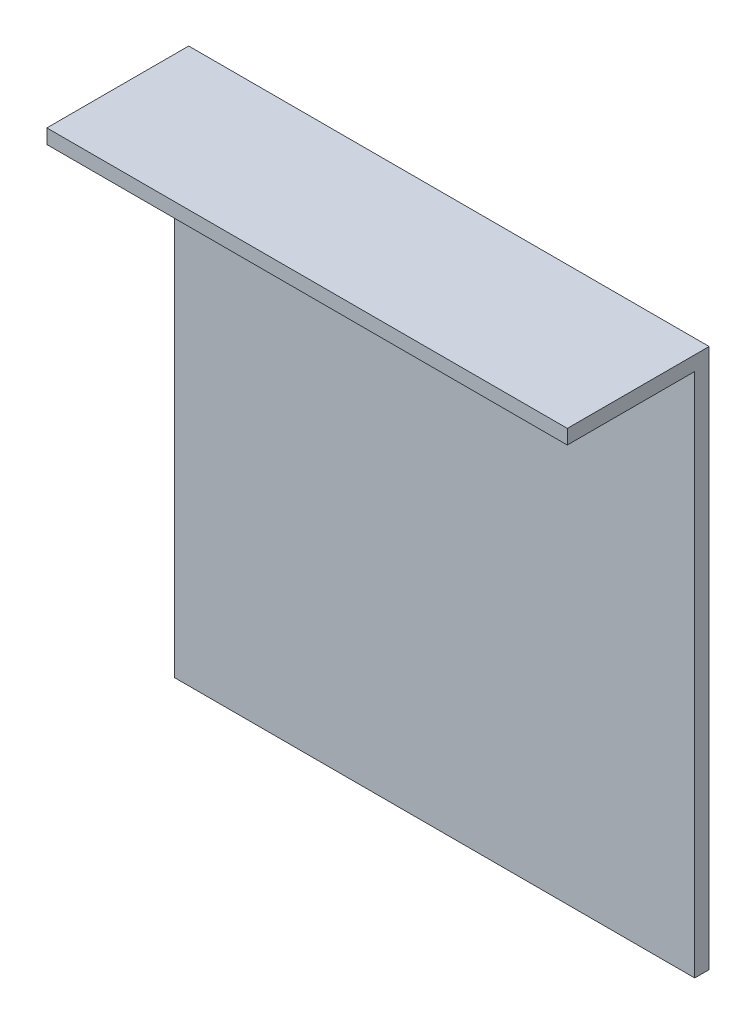
ISO-10303-21;
HEADER;
FILE_DESCRIPTION(('STEP AP214'),'2;1');
FILE_NAME('part.step','',(''),(''),'','','');
FILE_SCHEMA(('AUTOMOTIVE_DESIGN { 1 0 10303 214 1 1 1 1 }'));
ENDSEC;
DATA;
#1=APPLICATION_CONTEXT('core data for automotive mechanical design processes');
#2=APPLICATION_PROTOCOL_DEFINITION('international standard','automotive_design',2000,#1);
#3=PRODUCT_CONTEXT('',#1,'mechanical');
#4=PRODUCT('Part','Part','',(#3));
#5=PRODUCT_RELATED_PRODUCT_CATEGORY('part','',(#4));
#6=PRODUCT_DEFINITION_FORMATION('','',#4);
#7=PRODUCT_DEFINITION_CONTEXT('part definition',#1,'design');
#8=PRODUCT_DEFINITION('design','',#6,#7);
#9=PRODUCT_DEFINITION_SHAPE('','',#8);
#10=(LENGTH_UNIT() NAMED_UNIT(*) SI_UNIT(.MILLI.,.METRE.));
#11=(NAMED_UNIT(*) PLANE_ANGLE_UNIT() SI_UNIT($,.RADIAN.));
#12=(NAMED_UNIT(*) SI_UNIT($,.STERADIAN.) SOLID_ANGLE_UNIT());
#13=UNCERTAINTY_MEASURE_WITH_UNIT(LENGTH_MEASURE(1.E-05),#10,'distance_accuracy_value','');
#14=(GEOMETRIC_REPRESENTATION_CONTEXT(3) GLOBAL_UNCERTAINTY_ASSIGNED_CONTEXT((#13)) GLOBAL_UNIT_ASSIGNED_CONTEXT((#10,
#11,#12)) REPRESENTATION_CONTEXT('',''));
#15=CARTESIAN_POINT('',(0.,0.,0.));
#16=DIRECTION('',(0.,0.,1.));
#17=DIRECTION('',(1.,0.,0.));
#18=AXIS2_PLACEMENT_3D('',#15,#16,#17);
#19=CARTESIAN_POINT('',(-216.5,-230.,12.));
#20=DIRECTION('',(0.,1.,0.));
#21=DIRECTION('',(0.,0.,1.));
#22=AXIS2_PLACEMENT_3D('',#19,#20,#21);
#23=PLANE('',#22);
#24=DIRECTION('',(1.,0.,0.));
#25=VECTOR('',#24,1.);
#26=CARTESIAN_POINT('',(-216.5,-230.,0.));
#27=LINE('',#26,#25);
#28=CARTESIAN_POINT('',(-216.5,-230.,0.));
#29=VERTEX_POINT('',#28);
#30=CARTESIAN_POINT('',(216.5,-230.,0.));
#31=VERTEX_POINT('',#30);
#32=EDGE_CURVE('E91',#29,#31,#27,.T.);
#33=ORIENTED_EDGE('',*,*,#32,.T.);
#34=DIRECTION('',(0.,0.,-1.));
#35=VECTOR('',#34,1.);
#36=CARTESIAN_POINT('',(216.5,-230.,12.));
#37=LINE('',#36,#35);
#38=CARTESIAN_POINT('',(216.5,-230.,12.));
#39=VERTEX_POINT('',#38);
#40=EDGE_CURVE('E11',#39,#31,#37,.T.);
#41=ORIENTED_EDGE('',*,*,#40,.F.);
#42=DIRECTION('',(1.,0.,0.));
#43=VECTOR('',#42,1.);
#44=CARTESIAN_POINT('',(-216.5,-230.,12.));
#45=LINE('',#44,#43);
#46=CARTESIAN_POINT('',(-216.5,-230.,12.));
#47=VERTEX_POINT('',#46);
#48=EDGE_CURVE('E85',#47,#39,#45,.T.);
#49=ORIENTED_EDGE('',*,*,#48,.F.);
#50=DIRECTION('',(0.,0.,-1.));
#51=VECTOR('',#50,1.);
#52=CARTESIAN_POINT('',(-216.5,-230.,12.));
#53=LINE('',#52,#51);
#54=EDGE_CURVE('E77',#47,#29,#53,.T.);
#55=ORIENTED_EDGE('',*,*,#54,.T.);
#56=EDGE_LOOP('',(#33,#41,#49,#55));
#57=FACE_BOUND('',#56,.T.);
#58=ADVANCED_FACE('F33',(#57),#23,.F.);
#59=CARTESIAN_POINT('',(216.5,-230.,12.));
#60=DIRECTION('',(-1.,0.,0.));
#61=DIRECTION('',(0.,0.,1.));
#62=AXIS2_PLACEMENT_3D('',#59,#60,#61);
#63=PLANE('',#62);
#64=DIRECTION('',(0.,1.,0.));
#65=VECTOR('',#64,1.);
#66=CARTESIAN_POINT('',(216.5,-230.,0.));
#67=LINE('',#66,#65);
#68=CARTESIAN_POINT('',(216.5,219.,0.));
#69=VERTEX_POINT('',#68);
#70=EDGE_CURVE('E94',#31,#69,#67,.T.);
#71=ORIENTED_EDGE('',*,*,#70,.T.);
#72=DIRECTION('',(0.,0.,-1.));
#73=VECTOR('',#72,1.);
#74=CARTESIAN_POINT('',(216.5,219.,12.));
#75=LINE('',#74,#73);
#76=CARTESIAN_POINT('',(216.5,219.,118.));
#77=VERTEX_POINT('',#76);
#78=EDGE_CURVE('E41',#77,#69,#75,.T.);
#79=ORIENTED_EDGE('',*,*,#78,.F.);
#80=DIRECTION('',(0.,1.,0.));
#81=VECTOR('',#80,1.);
#82=CARTESIAN_POINT('',(216.5,219.,118.));
#83=LINE('',#82,#81);
#84=CARTESIAN_POINT('',(216.5,207.,118.));
#85=VERTEX_POINT('',#84);
#86=EDGE_CURVE('E128',#85,#77,#83,.T.);
#87=ORIENTED_EDGE('',*,*,#86,.F.);
#88=DIRECTION('',(0.,0.,-1.));
#89=VECTOR('',#88,1.);
#90=CARTESIAN_POINT('',(216.5,207.,118.));
#91=LINE('',#90,#89);
#92=CARTESIAN_POINT('',(216.5,207.,12.));
#93=VERTEX_POINT('',#92);
#94=EDGE_CURVE('E99',#85,#93,#91,.T.);
#95=ORIENTED_EDGE('',*,*,#94,.T.);
#96=DIRECTION('',(0.,1.,0.));
#97=VECTOR('',#96,1.);
#98=CARTESIAN_POINT('',(216.5,-230.,12.));
#99=LINE('',#98,#97);
#100=EDGE_CURVE('E108',#39,#93,#99,.T.);
#101=ORIENTED_EDGE('',*,*,#100,.F.);
#102=ORIENTED_EDGE('',*,*,#40,.T.);
#103=EDGE_LOOP('',(#71,#79,#87,#95,#101,#102));
#104=FACE_BOUND('',#103,.T.);
#105=ADVANCED_FACE('F148',(#104),#63,.F.);
#106=CARTESIAN_POINT('',(-216.5,219.,12.));
#107=DIRECTION('',(0.,-1.,0.));
#108=DIRECTION('',(0.,0.,-1.));
#109=AXIS2_PLACEMENT_3D('',#106,#107,#108);
#110=PLANE('',#109);
#111=DIRECTION('',(-1.,0.,0.));
#112=VECTOR('',#111,1.);
#113=CARTESIAN_POINT('',(-216.5,219.,0.));
#114=LINE('',#113,#112);
#115=CARTESIAN_POINT('',(-216.5,219.,0.));
#116=VERTEX_POINT('',#115);
#117=EDGE_CURVE('E86',#69,#116,#114,.T.);
#118=ORIENTED_EDGE('',*,*,#117,.T.);
#119=DIRECTION('',(0.,0.,-1.));
#120=VECTOR('',#119,1.);
#121=CARTESIAN_POINT('',(-216.5,219.,12.));
#122=LINE('',#121,#120);
#123=CARTESIAN_POINT('',(-216.5,219.,118.));
#124=VERTEX_POINT('',#123);
#125=EDGE_CURVE('E81',#124,#116,#122,.T.);
#126=ORIENTED_EDGE('',*,*,#125,.F.);
#127=DIRECTION('',(-1.,0.,0.));
#128=VECTOR('',#127,1.);
#129=CARTESIAN_POINT('',(-216.5,219.,118.));
#130=LINE('',#129,#128);
#131=EDGE_CURVE('E116',#77,#124,#130,.T.);
#132=ORIENTED_EDGE('',*,*,#131,.F.);
#133=ORIENTED_EDGE('',*,*,#78,.T.);
#134=EDGE_LOOP('',(#118,#126,#132,#133));
#135=FACE_BOUND('',#134,.T.);
#136=ADVANCED_FACE('F151',(#135),#110,.F.);
#137=CARTESIAN_POINT('',(-216.5,-230.,12.));
#138=DIRECTION('',(1.,0.,0.));
#139=DIRECTION('',(0.,0.,-1.));
#140=AXIS2_PLACEMENT_3D('',#137,#138,#139);
#141=PLANE('',#140);
#142=DIRECTION('',(0.,-1.,0.));
#143=VECTOR('',#142,1.);
#144=CARTESIAN_POINT('',(-216.5,-230.,0.));
#145=LINE('',#144,#143);
#146=EDGE_CURVE('E74',#116,#29,#145,.T.);
#147=ORIENTED_EDGE('',*,*,#146,.T.);
#148=ORIENTED_EDGE('',*,*,#54,.F.);
#149=DIRECTION('',(0.,-1.,0.));
#150=VECTOR('',#149,1.);
#151=CARTESIAN_POINT('',(-216.5,-230.,12.));
#152=LINE('',#151,#150);
#153=CARTESIAN_POINT('',(-216.5,207.,12.));
#154=VERTEX_POINT('',#153);
#155=EDGE_CURVE('E54',#154,#47,#152,.T.);
#156=ORIENTED_EDGE('',*,*,#155,.F.);
#157=DIRECTION('',(0.,0.,-1.));
#158=VECTOR('',#157,1.);
#159=CARTESIAN_POINT('',(-216.5,207.,118.));
#160=LINE('',#159,#158);
#161=CARTESIAN_POINT('',(-216.5,207.,118.));
#162=VERTEX_POINT('',#161);
#163=EDGE_CURVE('E95',#162,#154,#160,.T.);
#164=ORIENTED_EDGE('',*,*,#163,.F.);
#165=DIRECTION('',(0.,-1.,0.));
#166=VECTOR('',#165,1.);
#167=CARTESIAN_POINT('',(-216.5,219.,118.));
#168=LINE('',#167,#166);
#169=EDGE_CURVE('E119',#124,#162,#168,.T.);
#170=ORIENTED_EDGE('',*,*,#169,.F.);
#171=ORIENTED_EDGE('',*,*,#125,.T.);
#172=EDGE_LOOP('',(#147,#148,#156,#164,#170,#171));
#173=FACE_BOUND('',#172,.T.);
#174=ADVANCED_FACE('F76',(#173),#141,.F.);
#175=CARTESIAN_POINT('',(0.,0.,12.));
#176=DIRECTION('',(0.,0.,1.));
#177=DIRECTION('',(1.,0.,0.));
#178=AXIS2_PLACEMENT_3D('',#175,#176,#177);
#179=PLANE('',#178);
#180=DIRECTION('',(1.,0.,0.));
#181=VECTOR('',#180,1.);
#182=CARTESIAN_POINT('',(-216.5,207.,12.));
#183=LINE('',#182,#181);
#184=EDGE_CURVE('E49',#154,#93,#183,.T.);
#185=ORIENTED_EDGE('',*,*,#184,.F.);
#186=ORIENTED_EDGE('',*,*,#155,.T.);
#187=ORIENTED_EDGE('',*,*,#48,.T.);
#188=ORIENTED_EDGE('',*,*,#100,.T.);
#189=EDGE_LOOP('',(#185,#186,#187,#188));
#190=FACE_BOUND('',#189,.T.);
#191=ADVANCED_FACE('F153',(#190),#179,.T.);
#192=CARTESIAN_POINT('',(0.,0.,0.));
#193=DIRECTION('',(0.,0.,1.));
#194=DIRECTION('',(1.,0.,0.));
#195=AXIS2_PLACEMENT_3D('',#192,#193,#194);
#196=PLANE('',#195);
#197=ORIENTED_EDGE('',*,*,#32,.F.);
#198=ORIENTED_EDGE('',*,*,#146,.F.);
#199=ORIENTED_EDGE('',*,*,#117,.F.);
#200=ORIENTED_EDGE('',*,*,#70,.F.);
#201=EDGE_LOOP('',(#197,#198,#199,#200));
#202=FACE_BOUND('',#201,.T.);
#203=ADVANCED_FACE('F93',(#202),#196,.F.);
#204=CARTESIAN_POINT('',(-216.5,207.,118.));
#205=DIRECTION('',(0.,1.,0.));
#206=DIRECTION('',(0.,0.,1.));
#207=AXIS2_PLACEMENT_3D('',#204,#205,#206);
#208=PLANE('',#207);
#209=ORIENTED_EDGE('',*,*,#184,.T.);
#210=ORIENTED_EDGE('',*,*,#94,.F.);
#211=DIRECTION('',(1.,0.,0.));
#212=VECTOR('',#211,1.);
#213=CARTESIAN_POINT('',(-216.5,207.,118.));
#214=LINE('',#213,#212);
#215=EDGE_CURVE('E133',#162,#85,#214,.T.);
#216=ORIENTED_EDGE('',*,*,#215,.F.);
#217=ORIENTED_EDGE('',*,*,#163,.T.);
#218=EDGE_LOOP('',(#209,#210,#216,#217));
#219=FACE_BOUND('',#218,.T.);
#220=ADVANCED_FACE('F145',(#219),#208,.F.);
#221=CARTESIAN_POINT('',(0.,0.,118.));
#222=DIRECTION('',(0.,0.,1.));
#223=DIRECTION('',(1.,0.,0.));
#224=AXIS2_PLACEMENT_3D('',#221,#222,#223);
#225=PLANE('',#224);
#226=ORIENTED_EDGE('',*,*,#169,.T.);
#227=ORIENTED_EDGE('',*,*,#215,.T.);
#228=ORIENTED_EDGE('',*,*,#86,.T.);
#229=ORIENTED_EDGE('',*,*,#131,.T.);
#230=EDGE_LOOP('',(#226,#227,#228,#229));
#231=FACE_BOUND('',#230,.T.);
#232=ADVANCED_FACE('F140',(#231),#225,.T.);
#233=CLOSED_SHELL('',(#58,#105,#136,#174,#191,#203,#220,#232));
#234=MANIFOLD_SOLID_BREP('B2',#233);
#235=ADVANCED_BREP_SHAPE_REPRESENTATION('',(#18,#234),#14);
#236=SHAPE_DEFINITION_REPRESENTATION(#9,#235);
ENDSEC;
END-ISO-10303-21;
